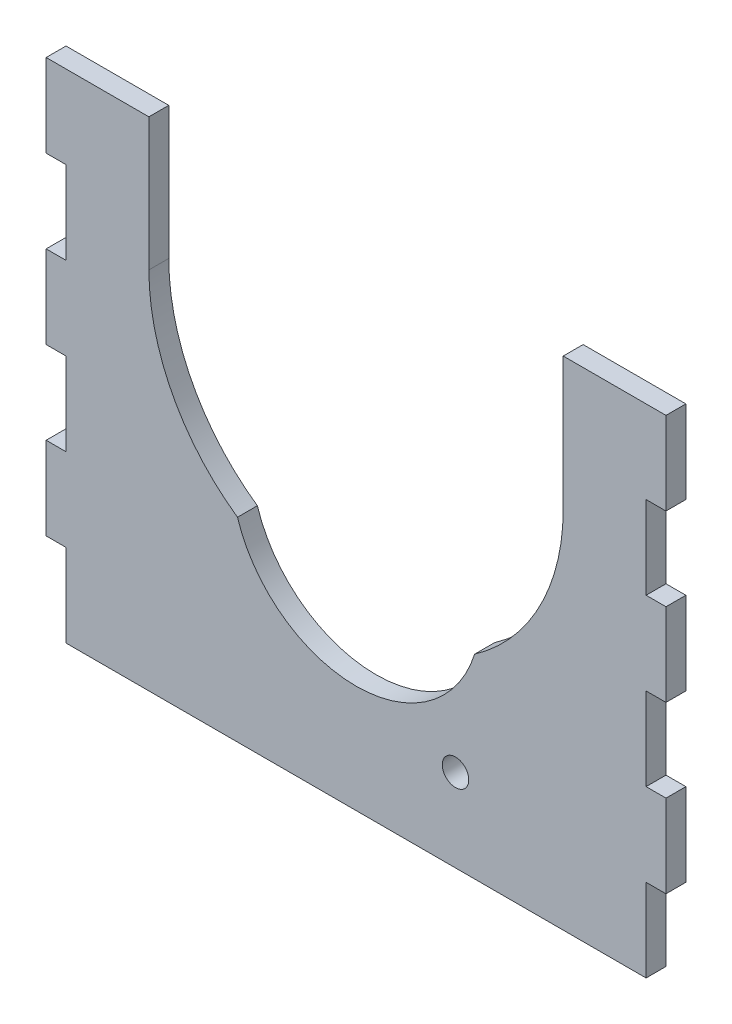
ISO-10303-21;
HEADER;
FILE_DESCRIPTION(('STEP AP214'),'2;1');
FILE_NAME('part.step','',(''),(''),'','','');
FILE_SCHEMA(('AUTOMOTIVE_DESIGN { 1 0 10303 214 1 1 1 1 }'));
ENDSEC;
DATA;
#1=APPLICATION_CONTEXT('core data for automotive mechanical design processes');
#2=APPLICATION_PROTOCOL_DEFINITION('international standard','automotive_design',2000,#1);
#3=PRODUCT_CONTEXT('',#1,'mechanical');
#4=PRODUCT('Part','Part','',(#3));
#5=PRODUCT_RELATED_PRODUCT_CATEGORY('part','',(#4));
#6=PRODUCT_DEFINITION_FORMATION('','',#4);
#7=PRODUCT_DEFINITION_CONTEXT('part definition',#1,'design');
#8=PRODUCT_DEFINITION('design','',#6,#7);
#9=PRODUCT_DEFINITION_SHAPE('','',#8);
#10=(LENGTH_UNIT() NAMED_UNIT(*) SI_UNIT(.MILLI.,.METRE.));
#11=(NAMED_UNIT(*) PLANE_ANGLE_UNIT() SI_UNIT($,.RADIAN.));
#12=(NAMED_UNIT(*) SI_UNIT($,.STERADIAN.) SOLID_ANGLE_UNIT());
#13=UNCERTAINTY_MEASURE_WITH_UNIT(LENGTH_MEASURE(1.E-05),#10,'distance_accuracy_value','');
#14=(GEOMETRIC_REPRESENTATION_CONTEXT(3) GLOBAL_UNCERTAINTY_ASSIGNED_CONTEXT((#13)) GLOBAL_UNIT_ASSIGNED_CONTEXT((#10,
#11,#12)) REPRESENTATION_CONTEXT('',''));
#15=CARTESIAN_POINT('',(0.,0.,0.));
#16=DIRECTION('',(0.,0.,1.));
#17=DIRECTION('',(1.,0.,0.));
#18=AXIS2_PLACEMENT_3D('',#15,#16,#17);
#19=CARTESIAN_POINT('',(0.,0.,6.));
#20=DIRECTION('',(-1.,0.,0.));
#21=DIRECTION('',(0.,0.,1.));
#22=AXIS2_PLACEMENT_3D('',#19,#20,#21);
#23=PLANE('',#22);
#24=DIRECTION('',(0.,1.,0.));
#25=VECTOR('',#24,1.);
#26=CARTESIAN_POINT('',(0.,0.,0.));
#27=LINE('',#26,#25);
#28=CARTESIAN_POINT('',(0.,0.,0.));
#29=VERTEX_POINT('',#28);
#30=CARTESIAN_POINT('',(0.,25.0000000000003,0.));
#31=VERTEX_POINT('',#30);
#32=EDGE_CURVE('E496',#29,#31,#27,.T.);
#33=ORIENTED_EDGE('',*,*,#32,.T.);
#34=DIRECTION('',(0.,0.,1.));
#35=VECTOR('',#34,1.);
#36=CARTESIAN_POINT('',(0.,25.0000000000003,0.));
#37=LINE('',#36,#35);
#38=CARTESIAN_POINT('',(0.,25.0000000000003,6.));
#39=VERTEX_POINT('',#38);
#40=EDGE_CURVE('E68',#31,#39,#37,.T.);
#41=ORIENTED_EDGE('',*,*,#40,.T.);
#42=DIRECTION('',(0.,1.,0.));
#43=VECTOR('',#42,1.);
#44=CARTESIAN_POINT('',(0.,0.,6.));
#45=LINE('',#44,#43);
#46=CARTESIAN_POINT('',(0.,0.,6.));
#47=VERTEX_POINT('',#46);
#48=EDGE_CURVE('E461',#47,#39,#45,.T.);
#49=ORIENTED_EDGE('',*,*,#48,.F.);
#50=DIRECTION('',(0.,0.,-1.));
#51=VECTOR('',#50,1.);
#52=CARTESIAN_POINT('',(0.,0.,6.));
#53=LINE('',#52,#51);
#54=EDGE_CURVE('E495',#47,#29,#53,.T.);
#55=ORIENTED_EDGE('',*,*,#54,.T.);
#56=EDGE_LOOP('',(#33,#41,#49,#55));
#57=FACE_BOUND('',#56,.T.);
#58=ADVANCED_FACE('F44',(#57),#23,.F.);
#59=CARTESIAN_POINT('',(-175.,0.,6.));
#60=DIRECTION('',(1.,0.,0.));
#61=DIRECTION('',(0.,1.,0.));
#62=AXIS2_PLACEMENT_3D('',#59,#60,#61);
#63=PLANE('',#62);
#64=DIRECTION('',(0.,-1.,0.));
#65=VECTOR('',#64,1.);
#66=CARTESIAN_POINT('',(-175.,0.,6.));
#67=LINE('',#66,#65);
#68=CARTESIAN_POINT('',(-175.,25.,6.));
#69=VERTEX_POINT('',#68);
#70=CARTESIAN_POINT('',(-175.,0.,6.));
#71=VERTEX_POINT('',#70);
#72=EDGE_CURVE('E486',#69,#71,#67,.T.);
#73=ORIENTED_EDGE('',*,*,#72,.F.);
#74=DIRECTION('',(0.,0.,1.));
#75=VECTOR('',#74,1.);
#76=CARTESIAN_POINT('',(-175.,25.,0.));
#77=LINE('',#76,#75);
#78=CARTESIAN_POINT('',(-175.,25.,0.));
#79=VERTEX_POINT('',#78);
#80=EDGE_CURVE('E320',#79,#69,#77,.T.);
#81=ORIENTED_EDGE('',*,*,#80,.F.);
#82=DIRECTION('',(0.,-1.,0.));
#83=VECTOR('',#82,1.);
#84=CARTESIAN_POINT('',(-175.,0.,0.));
#85=LINE('',#84,#83);
#86=CARTESIAN_POINT('',(-175.,0.,0.));
#87=VERTEX_POINT('',#86);
#88=EDGE_CURVE('E520',#79,#87,#85,.T.);
#89=ORIENTED_EDGE('',*,*,#88,.T.);
#90=DIRECTION('',(0.,0.,-1.));
#91=VECTOR('',#90,1.);
#92=CARTESIAN_POINT('',(-175.,0.,6.));
#93=LINE('',#92,#91);
#94=EDGE_CURVE('E531',#71,#87,#93,.T.);
#95=ORIENTED_EDGE('',*,*,#94,.F.);
#96=EDGE_LOOP('',(#73,#81,#89,#95));
#97=FACE_BOUND('',#96,.T.);
#98=ADVANCED_FACE('F621',(#97),#63,.F.);
#99=CARTESIAN_POINT('',(0.,50.0000000000003,6.));
#100=VERTEX_POINT('',#99);
#101=CARTESIAN_POINT('',(0.,75.0000000000003,6.));
#102=VERTEX_POINT('',#101);
#103=EDGE_CURVE('E60',#100,#102,#45,.T.);
#104=ORIENTED_EDGE('',*,*,#103,.F.);
#105=DIRECTION('',(0.,0.,1.));
#106=VECTOR('',#105,1.);
#107=CARTESIAN_POINT('',(0.,50.0000000000003,0.));
#108=LINE('',#107,#106);
#109=CARTESIAN_POINT('',(0.,50.0000000000003,0.));
#110=VERTEX_POINT('',#109);
#111=EDGE_CURVE('E255',#110,#100,#108,.T.);
#112=ORIENTED_EDGE('',*,*,#111,.F.);
#113=CARTESIAN_POINT('',(0.,75.0000000000003,0.));
#114=VERTEX_POINT('',#113);
#115=EDGE_CURVE('E266',#110,#114,#27,.T.);
#116=ORIENTED_EDGE('',*,*,#115,.T.);
#117=DIRECTION('',(0.,0.,1.));
#118=VECTOR('',#117,1.);
#119=CARTESIAN_POINT('',(0.,75.0000000000003,0.));
#120=LINE('',#119,#118);
#121=EDGE_CURVE('E361',#114,#102,#120,.T.);
#122=ORIENTED_EDGE('',*,*,#121,.T.);
#123=EDGE_LOOP('',(#104,#112,#116,#122));
#124=FACE_BOUND('',#123,.T.);
#125=ADVANCED_FACE('F595',(#124),#23,.F.);
#126=CARTESIAN_POINT('',(-175.,75.,0.));
#127=VERTEX_POINT('',#126);
#128=CARTESIAN_POINT('',(-175.,50.,0.));
#129=VERTEX_POINT('',#128);
#130=EDGE_CURVE('E525',#127,#129,#85,.T.);
#131=ORIENTED_EDGE('',*,*,#130,.T.);
#132=DIRECTION('',(0.,0.,1.));
#133=VECTOR('',#132,1.);
#134=CARTESIAN_POINT('',(-175.,50.,0.));
#135=LINE('',#134,#133);
#136=CARTESIAN_POINT('',(-175.,50.,6.));
#137=VERTEX_POINT('',#136);
#138=EDGE_CURVE('E309',#129,#137,#135,.T.);
#139=ORIENTED_EDGE('',*,*,#138,.T.);
#140=CARTESIAN_POINT('',(-175.,75.,6.));
#141=VERTEX_POINT('',#140);
#142=EDGE_CURVE('E492',#141,#137,#67,.T.);
#143=ORIENTED_EDGE('',*,*,#142,.F.);
#144=DIRECTION('',(0.,0.,1.));
#145=VECTOR('',#144,1.);
#146=CARTESIAN_POINT('',(-175.,75.,0.));
#147=LINE('',#146,#145);
#148=EDGE_CURVE('E394',#127,#141,#147,.T.);
#149=ORIENTED_EDGE('',*,*,#148,.F.);
#150=EDGE_LOOP('',(#131,#139,#143,#149));
#151=FACE_BOUND('',#150,.T.);
#152=ADVANCED_FACE('F627',(#151),#63,.F.);
#153=CARTESIAN_POINT('',(-175.,125.,0.));
#154=VERTEX_POINT('',#153);
#155=CARTESIAN_POINT('',(-175.,100.,0.));
#156=VERTEX_POINT('',#155);
#157=EDGE_CURVE('E521',#154,#156,#85,.T.);
#158=ORIENTED_EDGE('',*,*,#157,.T.);
#159=DIRECTION('',(0.,0.,1.));
#160=VECTOR('',#159,1.);
#161=CARTESIAN_POINT('',(-175.,100.,0.));
#162=LINE('',#161,#160);
#163=CARTESIAN_POINT('',(-175.,100.,6.));
#164=VERTEX_POINT('',#163);
#165=EDGE_CURVE('E383',#156,#164,#162,.T.);
#166=ORIENTED_EDGE('',*,*,#165,.T.);
#167=CARTESIAN_POINT('',(-175.,125.,6.));
#168=VERTEX_POINT('',#167);
#169=EDGE_CURVE('E487',#168,#164,#67,.T.);
#170=ORIENTED_EDGE('',*,*,#169,.F.);
#171=DIRECTION('',(0.,0.,1.));
#172=VECTOR('',#171,1.);
#173=CARTESIAN_POINT('',(-175.,125.,0.));
#174=LINE('',#173,#172);
#175=EDGE_CURVE('E450',#154,#168,#174,.T.);
#176=ORIENTED_EDGE('',*,*,#175,.F.);
#177=EDGE_LOOP('',(#158,#166,#170,#176));
#178=FACE_BOUND('',#177,.T.);
#179=ADVANCED_FACE('F628',(#178),#63,.F.);
#180=CARTESIAN_POINT('',(0.,100.,6.));
#181=VERTEX_POINT('',#180);
#182=CARTESIAN_POINT('',(0.,125.,6.));
#183=VERTEX_POINT('',#182);
#184=EDGE_CURVE('E465',#181,#183,#45,.T.);
#185=ORIENTED_EDGE('',*,*,#184,.F.);
#186=DIRECTION('',(0.,0.,1.));
#187=VECTOR('',#186,1.);
#188=CARTESIAN_POINT('',(0.,100.,0.));
#189=LINE('',#188,#187);
#190=CARTESIAN_POINT('',(0.,100.,0.));
#191=VERTEX_POINT('',#190);
#192=EDGE_CURVE('E364',#191,#181,#189,.T.);
#193=ORIENTED_EDGE('',*,*,#192,.F.);
#194=CARTESIAN_POINT('',(0.,125.,0.));
#195=VERTEX_POINT('',#194);
#196=EDGE_CURVE('E454',#191,#195,#27,.T.);
#197=ORIENTED_EDGE('',*,*,#196,.T.);
#198=DIRECTION('',(0.,0.,1.));
#199=VECTOR('',#198,1.);
#200=CARTESIAN_POINT('',(0.,125.,0.));
#201=LINE('',#200,#199);
#202=EDGE_CURVE('E427',#195,#183,#201,.T.);
#203=ORIENTED_EDGE('',*,*,#202,.T.);
#204=EDGE_LOOP('',(#185,#193,#197,#203));
#205=FACE_BOUND('',#204,.T.);
#206=ADVANCED_FACE('F46',(#205),#23,.F.);
#207=CARTESIAN_POINT('',(0.,150.,6.));
#208=DIRECTION('',(0.,-1.,0.));
#209=DIRECTION('',(1.,0.,0.));
#210=AXIS2_PLACEMENT_3D('',#207,#208,#209);
#211=PLANE('',#210);
#212=DIRECTION('',(-1.,0.,0.));
#213=VECTOR('',#212,1.);
#214=CARTESIAN_POINT('',(0.,150.,0.));
#215=LINE('',#214,#213);
#216=CARTESIAN_POINT('',(5.99999999999998,150.,0.));
#217=VERTEX_POINT('',#216);
#218=CARTESIAN_POINT('',(-25.,150.,0.));
#219=VERTEX_POINT('',#218);
#220=EDGE_CURVE('E499',#217,#219,#215,.T.);
#221=ORIENTED_EDGE('',*,*,#220,.T.);
#222=DIRECTION('',(0.,0.,-1.));
#223=VECTOR('',#222,1.);
#224=CARTESIAN_POINT('',(-25.,150.,6.));
#225=LINE('',#224,#223);
#226=CARTESIAN_POINT('',(-25.,150.,6.));
#227=VERTEX_POINT('',#226);
#228=EDGE_CURVE('E11',#227,#219,#225,.T.);
#229=ORIENTED_EDGE('',*,*,#228,.F.);
#230=DIRECTION('',(-1.,0.,0.));
#231=VECTOR('',#230,1.);
#232=CARTESIAN_POINT('',(0.,150.,6.));
#233=LINE('',#232,#231);
#234=CARTESIAN_POINT('',(5.99999999999998,150.,6.));
#235=VERTEX_POINT('',#234);
#236=EDGE_CURVE('E464',#235,#227,#233,.T.);
#237=ORIENTED_EDGE('',*,*,#236,.F.);
#238=DIRECTION('',(0.,0.,1.));
#239=VECTOR('',#238,1.);
#240=CARTESIAN_POINT('',(5.99999999999998,150.,0.));
#241=LINE('',#240,#239);
#242=EDGE_CURVE('E416',#217,#235,#241,.T.);
#243=ORIENTED_EDGE('',*,*,#242,.F.);
#244=EDGE_LOOP('',(#221,#229,#237,#243));
#245=FACE_BOUND('',#244,.T.);
#246=ADVANCED_FACE('F579',(#245),#211,.F.);
#247=CARTESIAN_POINT('',(-25.,110.,6.));
#248=DIRECTION('',(1.,0.,0.));
#249=DIRECTION('',(0.,1.,0.));
#250=AXIS2_PLACEMENT_3D('',#247,#248,#249);
#251=PLANE('',#250);
#252=DIRECTION('',(0.,-1.,0.));
#253=VECTOR('',#252,1.);
#254=CARTESIAN_POINT('',(-25.,110.,0.));
#255=LINE('',#254,#253);
#256=CARTESIAN_POINT('',(-25.,110.,0.));
#257=VERTEX_POINT('',#256);
#258=EDGE_CURVE('E502',#219,#257,#255,.T.);
#259=ORIENTED_EDGE('',*,*,#258,.T.);
#260=DIRECTION('',(0.,0.,-1.));
#261=VECTOR('',#260,1.);
#262=CARTESIAN_POINT('',(-25.,110.,6.));
#263=LINE('',#262,#261);
#264=CARTESIAN_POINT('',(-25.,110.,6.));
#265=VERTEX_POINT('',#264);
#266=EDGE_CURVE('E53',#265,#257,#263,.T.);
#267=ORIENTED_EDGE('',*,*,#266,.F.);
#268=DIRECTION('',(0.,-1.,0.));
#269=VECTOR('',#268,1.);
#270=CARTESIAN_POINT('',(-25.,110.,6.));
#271=LINE('',#270,#269);
#272=EDGE_CURVE('E468',#227,#265,#271,.T.);
#273=ORIENTED_EDGE('',*,*,#272,.F.);
#274=ORIENTED_EDGE('',*,*,#228,.T.);
#275=EDGE_LOOP('',(#259,#267,#273,#274));
#276=FACE_BOUND('',#275,.T.);
#277=ADVANCED_FACE('F577',(#276),#251,.F.);
#278=CARTESIAN_POINT('',(-87.5,110.,6.));
#279=DIRECTION('',(0.,0.,-1.));
#280=DIRECTION('',(-1.,0.,0.));
#281=AXIS2_PLACEMENT_3D('',#278,#279,#280);
#282=CYLINDRICAL_SURFACE('',#281,62.5);
#283=CARTESIAN_POINT('',(-87.5,110.,0.));
#284=DIRECTION('',(0.,0.,-1.));
#285=DIRECTION('',(1.,0.,0.));
#286=AXIS2_PLACEMENT_3D('',#283,#284,#285);
#287=CIRCLE('',#286,62.5);
#288=CARTESIAN_POINT('',(-51.7272799468645,58.75,0.));
#289=VERTEX_POINT('',#288);
#290=EDGE_CURVE('E505',#257,#289,#287,.T.);
#291=ORIENTED_EDGE('',*,*,#290,.T.);
#292=DIRECTION('',(0.,0.,-1.));
#293=VECTOR('',#292,1.);
#294=CARTESIAN_POINT('',(-51.7272799468645,58.75,6.));
#295=LINE('',#294,#293);
#296=CARTESIAN_POINT('',(-51.7272799468645,58.75,6.));
#297=VERTEX_POINT('',#296);
#298=EDGE_CURVE('E547',#297,#289,#295,.T.);
#299=ORIENTED_EDGE('',*,*,#298,.F.);
#300=CARTESIAN_POINT('',(-87.5,110.,6.));
#301=DIRECTION('',(0.,0.,-1.));
#302=DIRECTION('',(1.,0.,0.));
#303=AXIS2_PLACEMENT_3D('',#300,#301,#302);
#304=CIRCLE('',#303,62.5);
#305=EDGE_CURVE('E471',#265,#297,#304,.T.);
#306=ORIENTED_EDGE('',*,*,#305,.F.);
#307=ORIENTED_EDGE('',*,*,#266,.T.);
#308=EDGE_LOOP('',(#291,#299,#306,#307));
#309=FACE_BOUND('',#308,.T.);
#310=ADVANCED_FACE('F556',(#309),#282,.F.);
#311=CARTESIAN_POINT('',(-87.5,70.,6.));
#312=DIRECTION('',(0.,0.,-1.));
#313=DIRECTION('',(-1.,0.,0.));
#314=AXIS2_PLACEMENT_3D('',#311,#312,#313);
#315=CYLINDRICAL_SURFACE('',#314,37.5);
#316=CARTESIAN_POINT('',(-87.5,70.,0.));
#317=DIRECTION('',(0.,0.,-1.));
#318=DIRECTION('',(1.,0.,0.));
#319=AXIS2_PLACEMENT_3D('',#316,#317,#318);
#320=CIRCLE('',#319,37.5);
#321=CARTESIAN_POINT('',(-123.272720053135,58.75,0.));
#322=VERTEX_POINT('',#321);
#323=EDGE_CURVE('E508',#289,#322,#320,.T.);
#324=ORIENTED_EDGE('',*,*,#323,.T.);
#325=DIRECTION('',(0.,0.,-1.));
#326=VECTOR('',#325,1.);
#327=CARTESIAN_POINT('',(-123.272720053135,58.75,6.));
#328=LINE('',#327,#326);
#329=CARTESIAN_POINT('',(-123.272720053135,58.75,6.));
#330=VERTEX_POINT('',#329);
#331=EDGE_CURVE('E543',#330,#322,#328,.T.);
#332=ORIENTED_EDGE('',*,*,#331,.F.);
#333=CARTESIAN_POINT('',(-87.5,70.,6.));
#334=DIRECTION('',(0.,0.,-1.));
#335=DIRECTION('',(1.,0.,0.));
#336=AXIS2_PLACEMENT_3D('',#333,#334,#335);
#337=CIRCLE('',#336,37.5);
#338=EDGE_CURVE('E474',#297,#330,#337,.T.);
#339=ORIENTED_EDGE('',*,*,#338,.F.);
#340=ORIENTED_EDGE('',*,*,#298,.T.);
#341=EDGE_LOOP('',(#324,#332,#339,#340));
#342=FACE_BOUND('',#341,.T.);
#343=ADVANCED_FACE('F566',(#342),#315,.F.);
#344=CARTESIAN_POINT('',(-87.5,110.,6.));
#345=DIRECTION('',(0.,0.,-1.));
#346=DIRECTION('',(-1.,0.,0.));
#347=AXIS2_PLACEMENT_3D('',#344,#345,#346);
#348=CYLINDRICAL_SURFACE('',#347,62.5);
#349=CARTESIAN_POINT('',(-87.5,110.,0.));
#350=DIRECTION('',(0.,0.,-1.));
#351=DIRECTION('',(1.,0.,0.));
#352=AXIS2_PLACEMENT_3D('',#349,#350,#351);
#353=CIRCLE('',#352,62.5);
#354=CARTESIAN_POINT('',(-150.,110.,0.));
#355=VERTEX_POINT('',#354);
#356=EDGE_CURVE('E511',#322,#355,#353,.T.);
#357=ORIENTED_EDGE('',*,*,#356,.T.);
#358=DIRECTION('',(0.,0.,-1.));
#359=VECTOR('',#358,1.);
#360=CARTESIAN_POINT('',(-150.,110.,6.));
#361=LINE('',#360,#359);
#362=CARTESIAN_POINT('',(-150.,110.,6.));
#363=VERTEX_POINT('',#362);
#364=EDGE_CURVE('E539',#363,#355,#361,.T.);
#365=ORIENTED_EDGE('',*,*,#364,.F.);
#366=CARTESIAN_POINT('',(-87.5,110.,6.));
#367=DIRECTION('',(0.,0.,-1.));
#368=DIRECTION('',(1.,0.,0.));
#369=AXIS2_PLACEMENT_3D('',#366,#367,#368);
#370=CIRCLE('',#369,62.5);
#371=EDGE_CURVE('E477',#330,#363,#370,.T.);
#372=ORIENTED_EDGE('',*,*,#371,.F.);
#373=ORIENTED_EDGE('',*,*,#331,.T.);
#374=EDGE_LOOP('',(#357,#365,#372,#373));
#375=FACE_BOUND('',#374,.T.);
#376=ADVANCED_FACE('F570',(#375),#348,.F.);
#377=CARTESIAN_POINT('',(-150.,110.,6.));
#378=DIRECTION('',(-1.,0.,0.));
#379=DIRECTION('',(0.,-1.,0.));
#380=AXIS2_PLACEMENT_3D('',#377,#378,#379);
#381=PLANE('',#380);
#382=DIRECTION('',(0.,1.,0.));
#383=VECTOR('',#382,1.);
#384=CARTESIAN_POINT('',(-150.,110.,0.));
#385=LINE('',#384,#383);
#386=CARTESIAN_POINT('',(-150.,150.,0.));
#387=VERTEX_POINT('',#386);
#388=EDGE_CURVE('E514',#355,#387,#385,.T.);
#389=ORIENTED_EDGE('',*,*,#388,.T.);
#390=DIRECTION('',(0.,0.,-1.));
#391=VECTOR('',#390,1.);
#392=CARTESIAN_POINT('',(-150.,150.,6.));
#393=LINE('',#392,#391);
#394=CARTESIAN_POINT('',(-150.,150.,6.));
#395=VERTEX_POINT('',#394);
#396=EDGE_CURVE('E535',#395,#387,#393,.T.);
#397=ORIENTED_EDGE('',*,*,#396,.F.);
#398=DIRECTION('',(0.,1.,0.));
#399=VECTOR('',#398,1.);
#400=CARTESIAN_POINT('',(-150.,110.,6.));
#401=LINE('',#400,#399);
#402=EDGE_CURVE('E480',#363,#395,#401,.T.);
#403=ORIENTED_EDGE('',*,*,#402,.F.);
#404=ORIENTED_EDGE('',*,*,#364,.T.);
#405=EDGE_LOOP('',(#389,#397,#403,#404));
#406=FACE_BOUND('',#405,.T.);
#407=ADVANCED_FACE('F647',(#406),#381,.F.);
#408=CARTESIAN_POINT('',(-150.,150.,6.));
#409=DIRECTION('',(0.,-1.,0.));
#410=DIRECTION('',(1.,0.,0.));
#411=AXIS2_PLACEMENT_3D('',#408,#409,#410);
#412=PLANE('',#411);
#413=DIRECTION('',(-1.,0.,0.));
#414=VECTOR('',#413,1.);
#415=CARTESIAN_POINT('',(-150.,150.,0.));
#416=LINE('',#415,#414);
#417=CARTESIAN_POINT('',(-181.,150.,0.));
#418=VERTEX_POINT('',#417);
#419=EDGE_CURVE('E517',#387,#418,#416,.T.);
#420=ORIENTED_EDGE('',*,*,#419,.T.);
#421=DIRECTION('',(0.,0.,1.));
#422=VECTOR('',#421,1.);
#423=CARTESIAN_POINT('',(-181.,150.,0.));
#424=LINE('',#423,#422);
#425=CARTESIAN_POINT('',(-181.,150.,6.));
#426=VERTEX_POINT('',#425);
#427=EDGE_CURVE('E443',#418,#426,#424,.T.);
#428=ORIENTED_EDGE('',*,*,#427,.T.);
#429=DIRECTION('',(-1.,0.,0.));
#430=VECTOR('',#429,1.);
#431=CARTESIAN_POINT('',(-150.,150.,6.));
#432=LINE('',#431,#430);
#433=EDGE_CURVE('E483',#395,#426,#432,.T.);
#434=ORIENTED_EDGE('',*,*,#433,.F.);
#435=ORIENTED_EDGE('',*,*,#396,.T.);
#436=EDGE_LOOP('',(#420,#428,#434,#435));
#437=FACE_BOUND('',#436,.T.);
#438=ADVANCED_FACE('F644',(#437),#412,.F.);
#439=CARTESIAN_POINT('',(0.,0.,6.));
#440=DIRECTION('',(0.,1.,0.));
#441=DIRECTION('',(-1.,0.,0.));
#442=AXIS2_PLACEMENT_3D('',#439,#440,#441);
#443=PLANE('',#442);
#444=DIRECTION('',(1.,0.,0.));
#445=VECTOR('',#444,1.);
#446=CARTESIAN_POINT('',(0.,0.,0.));
#447=LINE('',#446,#445);
#448=EDGE_CURVE('E524',#87,#29,#447,.T.);
#449=ORIENTED_EDGE('',*,*,#448,.T.);
#450=ORIENTED_EDGE('',*,*,#54,.F.);
#451=DIRECTION('',(1.,0.,0.));
#452=VECTOR('',#451,1.);
#453=CARTESIAN_POINT('',(0.,0.,6.));
#454=LINE('',#453,#452);
#455=EDGE_CURVE('E491',#71,#47,#454,.T.);
#456=ORIENTED_EDGE('',*,*,#455,.F.);
#457=ORIENTED_EDGE('',*,*,#94,.T.);
#458=EDGE_LOOP('',(#449,#450,#456,#457));
#459=FACE_BOUND('',#458,.T.);
#460=ADVANCED_FACE('F642',(#459),#443,.F.);
#461=CARTESIAN_POINT('',(-87.5,110.,6.));
#462=DIRECTION('',(0.,0.,1.));
#463=DIRECTION('',(1.,0.,0.));
#464=AXIS2_PLACEMENT_3D('',#461,#462,#463);
#465=PLANE('',#464);
#466=CARTESIAN_POINT('',(-57.5,25.,6.));
#467=DIRECTION('',(0.,0.,1.));
#468=DIRECTION('',(1.,0.,0.));
#469=AXIS2_PLACEMENT_3D('',#466,#467,#468);
#470=CIRCLE('',#469,4.00000000000001);
#471=CARTESIAN_POINT('',(-53.5,25.,6.));
#472=VERTEX_POINT('',#471);
#473=EDGE_CURVE('E278',#472,#472,#470,.T.);
#474=ORIENTED_EDGE('',*,*,#473,.F.);
#475=EDGE_LOOP('',(#474));
#476=FACE_BOUND('',#475,.T.);
#477=ORIENTED_EDGE('',*,*,#48,.T.);
#478=DIRECTION('',(1.,0.,0.));
#479=VECTOR('',#478,1.);
#480=CARTESIAN_POINT('',(6.00000000000001,25.0000000000003,6.));
#481=LINE('',#480,#479);
#482=CARTESIAN_POINT('',(6.00000000000001,25.0000000000003,6.));
#483=VERTEX_POINT('',#482);
#484=EDGE_CURVE('E272',#39,#483,#481,.T.);
#485=ORIENTED_EDGE('',*,*,#484,.T.);
#486=DIRECTION('',(0.,1.,0.));
#487=VECTOR('',#486,1.);
#488=CARTESIAN_POINT('',(6.00000000000001,50.0000000000003,6.));
#489=LINE('',#488,#487);
#490=CARTESIAN_POINT('',(6.00000000000001,50.0000000000003,6.));
#491=VERTEX_POINT('',#490);
#492=EDGE_CURVE('E283',#483,#491,#489,.T.);
#493=ORIENTED_EDGE('',*,*,#492,.T.);
#494=DIRECTION('',(-1.,0.,0.));
#495=VECTOR('',#494,1.);
#496=CARTESIAN_POINT('',(6.00000000000001,50.0000000000003,6.));
#497=LINE('',#496,#495);
#498=EDGE_CURVE('E249',#491,#100,#497,.T.);
#499=ORIENTED_EDGE('',*,*,#498,.T.);
#500=ORIENTED_EDGE('',*,*,#103,.T.);
#501=DIRECTION('',(1.,0.,0.));
#502=VECTOR('',#501,1.);
#503=CARTESIAN_POINT('',(5.99999999999998,75.0000000000003,6.));
#504=LINE('',#503,#502);
#505=CARTESIAN_POINT('',(5.99999999999998,75.0000000000003,6.));
#506=VERTEX_POINT('',#505);
#507=EDGE_CURVE('E338',#102,#506,#504,.T.);
#508=ORIENTED_EDGE('',*,*,#507,.T.);
#509=DIRECTION('',(0.,1.,0.));
#510=VECTOR('',#509,1.);
#511=CARTESIAN_POINT('',(5.99999999999998,100.,6.));
#512=LINE('',#511,#510);
#513=CARTESIAN_POINT('',(5.99999999999998,100.,6.));
#514=VERTEX_POINT('',#513);
#515=EDGE_CURVE('E324',#506,#514,#512,.T.);
#516=ORIENTED_EDGE('',*,*,#515,.T.);
#517=DIRECTION('',(-1.,0.,0.));
#518=VECTOR('',#517,1.);
#519=CARTESIAN_POINT('',(5.99999999999998,100.,6.));
#520=LINE('',#519,#518);
#521=EDGE_CURVE('E350',#514,#181,#520,.T.);
#522=ORIENTED_EDGE('',*,*,#521,.T.);
#523=ORIENTED_EDGE('',*,*,#184,.T.);
#524=DIRECTION('',(1.,0.,0.));
#525=VECTOR('',#524,1.);
#526=CARTESIAN_POINT('',(5.99999999999998,125.,6.));
#527=LINE('',#526,#525);
#528=CARTESIAN_POINT('',(5.99999999999998,125.,6.));
#529=VERTEX_POINT('',#528);
#530=EDGE_CURVE('E412',#183,#529,#527,.T.);
#531=ORIENTED_EDGE('',*,*,#530,.T.);
#532=DIRECTION('',(0.,1.,0.));
#533=VECTOR('',#532,1.);
#534=CARTESIAN_POINT('',(5.99999999999998,150.,6.));
#535=LINE('',#534,#533);
#536=EDGE_CURVE('E398',#529,#235,#535,.T.);
#537=ORIENTED_EDGE('',*,*,#536,.T.);
#538=ORIENTED_EDGE('',*,*,#236,.T.);
#539=ORIENTED_EDGE('',*,*,#272,.T.);
#540=ORIENTED_EDGE('',*,*,#305,.T.);
#541=ORIENTED_EDGE('',*,*,#338,.T.);
#542=ORIENTED_EDGE('',*,*,#371,.T.);
#543=ORIENTED_EDGE('',*,*,#402,.T.);
#544=ORIENTED_EDGE('',*,*,#433,.T.);
#545=DIRECTION('',(0.,-1.,0.));
#546=VECTOR('',#545,1.);
#547=CARTESIAN_POINT('',(-181.,150.,6.));
#548=LINE('',#547,#546);
#549=CARTESIAN_POINT('',(-181.,125.,6.));
#550=VERTEX_POINT('',#549);
#551=EDGE_CURVE('E426',#426,#550,#548,.T.);
#552=ORIENTED_EDGE('',*,*,#551,.T.);
#553=DIRECTION('',(1.,0.,0.));
#554=VECTOR('',#553,1.);
#555=CARTESIAN_POINT('',(-175.,125.,6.));
#556=LINE('',#555,#554);
#557=EDGE_CURVE('E439',#550,#168,#556,.T.);
#558=ORIENTED_EDGE('',*,*,#557,.T.);
#559=ORIENTED_EDGE('',*,*,#169,.T.);
#560=DIRECTION('',(-1.,0.,0.));
#561=VECTOR('',#560,1.);
#562=CARTESIAN_POINT('',(-175.,100.,6.));
#563=LINE('',#562,#561);
#564=CARTESIAN_POINT('',(-181.,100.,6.));
#565=VERTEX_POINT('',#564);
#566=EDGE_CURVE('E360',#164,#565,#563,.T.);
#567=ORIENTED_EDGE('',*,*,#566,.T.);
#568=DIRECTION('',(0.,-1.,0.));
#569=VECTOR('',#568,1.);
#570=CARTESIAN_POINT('',(-181.,100.,6.));
#571=LINE('',#570,#569);
#572=CARTESIAN_POINT('',(-181.,75.,6.));
#573=VERTEX_POINT('',#572);
#574=EDGE_CURVE('E387',#565,#573,#571,.T.);
#575=ORIENTED_EDGE('',*,*,#574,.T.);
#576=DIRECTION('',(1.,0.,0.));
#577=VECTOR('',#576,1.);
#578=CARTESIAN_POINT('',(-175.,75.,6.));
#579=LINE('',#578,#577);
#580=EDGE_CURVE('E375',#573,#141,#579,.T.);
#581=ORIENTED_EDGE('',*,*,#580,.T.);
#582=ORIENTED_EDGE('',*,*,#142,.T.);
#583=DIRECTION('',(-1.,0.,0.));
#584=VECTOR('',#583,1.);
#585=CARTESIAN_POINT('',(-175.,50.,6.));
#586=LINE('',#585,#584);
#587=CARTESIAN_POINT('',(-181.,50.,6.));
#588=VERTEX_POINT('',#587);
#589=EDGE_CURVE('E291',#137,#588,#586,.T.);
#590=ORIENTED_EDGE('',*,*,#589,.T.);
#591=DIRECTION('',(0.,-1.,0.));
#592=VECTOR('',#591,1.);
#593=CARTESIAN_POINT('',(-181.,50.,6.));
#594=LINE('',#593,#592);
#595=CARTESIAN_POINT('',(-181.,25.,6.));
#596=VERTEX_POINT('',#595);
#597=EDGE_CURVE('E313',#588,#596,#594,.T.);
#598=ORIENTED_EDGE('',*,*,#597,.T.);
#599=DIRECTION('',(1.,0.,0.));
#600=VECTOR('',#599,1.);
#601=CARTESIAN_POINT('',(-175.,25.,6.));
#602=LINE('',#601,#600);
#603=EDGE_CURVE('E301',#596,#69,#602,.T.);
#604=ORIENTED_EDGE('',*,*,#603,.T.);
#605=ORIENTED_EDGE('',*,*,#72,.T.);
#606=ORIENTED_EDGE('',*,*,#455,.T.);
#607=EDGE_LOOP('',(#477,#485,#493,#499,#500,#508,#516,#522,#523,#531,#537,#538,#539,#540,#541,
#542,#543,#544,#552,#558,#559,#567,#575,#581,#582,#590,#598,#604,#605,#606));
#608=FACE_BOUND('',#607,.T.);
#609=ADVANCED_FACE('F574',(#476,#608),#465,.T.);
#610=CARTESIAN_POINT('',(-87.5,110.,0.));
#611=DIRECTION('',(0.,0.,1.));
#612=DIRECTION('',(1.,0.,0.));
#613=AXIS2_PLACEMENT_3D('',#610,#611,#612);
#614=PLANE('',#613);
#615=CARTESIAN_POINT('',(-57.5,25.,0.));
#616=DIRECTION('',(0.,0.,1.));
#617=DIRECTION('',(1.,0.,0.));
#618=AXIS2_PLACEMENT_3D('',#615,#616,#617);
#619=CIRCLE('',#618,4.00000000000001);
#620=CARTESIAN_POINT('',(-53.5,25.,0.));
#621=VERTEX_POINT('',#620);
#622=EDGE_CURVE('E286',#621,#621,#619,.T.);
#623=ORIENTED_EDGE('',*,*,#622,.T.);
#624=EDGE_LOOP('',(#623));
#625=FACE_BOUND('',#624,.T.);
#626=ORIENTED_EDGE('',*,*,#32,.F.);
#627=ORIENTED_EDGE('',*,*,#448,.F.);
#628=ORIENTED_EDGE('',*,*,#88,.F.);
#629=DIRECTION('',(1.,0.,0.));
#630=VECTOR('',#629,1.);
#631=CARTESIAN_POINT('',(-175.,25.,0.));
#632=LINE('',#631,#630);
#633=CARTESIAN_POINT('',(-181.,25.,0.));
#634=VERTEX_POINT('',#633);
#635=EDGE_CURVE('E305',#634,#79,#632,.T.);
#636=ORIENTED_EDGE('',*,*,#635,.F.);
#637=DIRECTION('',(0.,-1.,0.));
#638=VECTOR('',#637,1.);
#639=CARTESIAN_POINT('',(-181.,50.,0.));
#640=LINE('',#639,#638);
#641=CARTESIAN_POINT('',(-181.,50.,0.));
#642=VERTEX_POINT('',#641);
#643=EDGE_CURVE('E300',#642,#634,#640,.T.);
#644=ORIENTED_EDGE('',*,*,#643,.F.);
#645=DIRECTION('',(-1.,0.,0.));
#646=VECTOR('',#645,1.);
#647=CARTESIAN_POINT('',(-175.,50.,0.));
#648=LINE('',#647,#646);
#649=EDGE_CURVE('E296',#129,#642,#648,.T.);
#650=ORIENTED_EDGE('',*,*,#649,.F.);
#651=ORIENTED_EDGE('',*,*,#130,.F.);
#652=DIRECTION('',(1.,0.,0.));
#653=VECTOR('',#652,1.);
#654=CARTESIAN_POINT('',(-175.,75.,0.));
#655=LINE('',#654,#653);
#656=CARTESIAN_POINT('',(-181.,75.,0.));
#657=VERTEX_POINT('',#656);
#658=EDGE_CURVE('E379',#657,#127,#655,.T.);
#659=ORIENTED_EDGE('',*,*,#658,.F.);
#660=DIRECTION('',(0.,-1.,0.));
#661=VECTOR('',#660,1.);
#662=CARTESIAN_POINT('',(-181.,100.,0.));
#663=LINE('',#662,#661);
#664=CARTESIAN_POINT('',(-181.,100.,0.));
#665=VERTEX_POINT('',#664);
#666=EDGE_CURVE('E374',#665,#657,#663,.T.);
#667=ORIENTED_EDGE('',*,*,#666,.F.);
#668=DIRECTION('',(-1.,0.,0.));
#669=VECTOR('',#668,1.);
#670=CARTESIAN_POINT('',(-175.,100.,0.));
#671=LINE('',#670,#669);
#672=EDGE_CURVE('E370',#156,#665,#671,.T.);
#673=ORIENTED_EDGE('',*,*,#672,.F.);
#674=ORIENTED_EDGE('',*,*,#157,.F.);
#675=DIRECTION('',(1.,0.,0.));
#676=VECTOR('',#675,1.);
#677=CARTESIAN_POINT('',(-175.,125.,0.));
#678=LINE('',#677,#676);
#679=CARTESIAN_POINT('',(-181.,125.,0.));
#680=VERTEX_POINT('',#679);
#681=EDGE_CURVE('E438',#680,#154,#678,.T.);
#682=ORIENTED_EDGE('',*,*,#681,.F.);
#683=DIRECTION('',(0.,-1.,0.));
#684=VECTOR('',#683,1.);
#685=CARTESIAN_POINT('',(-181.,150.,0.));
#686=LINE('',#685,#684);
#687=EDGE_CURVE('E434',#418,#680,#686,.T.);
#688=ORIENTED_EDGE('',*,*,#687,.F.);
#689=ORIENTED_EDGE('',*,*,#419,.F.);
#690=ORIENTED_EDGE('',*,*,#388,.F.);
#691=ORIENTED_EDGE('',*,*,#356,.F.);
#692=ORIENTED_EDGE('',*,*,#323,.F.);
#693=ORIENTED_EDGE('',*,*,#290,.F.);
#694=ORIENTED_EDGE('',*,*,#258,.F.);
#695=ORIENTED_EDGE('',*,*,#220,.F.);
#696=DIRECTION('',(0.,1.,0.));
#697=VECTOR('',#696,1.);
#698=CARTESIAN_POINT('',(5.99999999999998,150.,0.));
#699=LINE('',#698,#697);
#700=CARTESIAN_POINT('',(5.99999999999998,125.,0.));
#701=VERTEX_POINT('',#700);
#702=EDGE_CURVE('E407',#701,#217,#699,.T.);
#703=ORIENTED_EDGE('',*,*,#702,.F.);
#704=DIRECTION('',(1.,0.,0.));
#705=VECTOR('',#704,1.);
#706=CARTESIAN_POINT('',(5.99999999999998,125.,0.));
#707=LINE('',#706,#705);
#708=EDGE_CURVE('E411',#195,#701,#707,.T.);
#709=ORIENTED_EDGE('',*,*,#708,.F.);
#710=ORIENTED_EDGE('',*,*,#196,.F.);
#711=DIRECTION('',(-1.,0.,0.));
#712=VECTOR('',#711,1.);
#713=CARTESIAN_POINT('',(5.99999999999998,100.,0.));
#714=LINE('',#713,#712);
#715=CARTESIAN_POINT('',(5.99999999999998,100.,0.));
#716=VERTEX_POINT('',#715);
#717=EDGE_CURVE('E337',#716,#191,#714,.T.);
#718=ORIENTED_EDGE('',*,*,#717,.F.);
#719=DIRECTION('',(0.,1.,0.));
#720=VECTOR('',#719,1.);
#721=CARTESIAN_POINT('',(5.99999999999998,100.,0.));
#722=LINE('',#721,#720);
#723=CARTESIAN_POINT('',(5.99999999999998,75.0000000000003,0.));
#724=VERTEX_POINT('',#723);
#725=EDGE_CURVE('E333',#724,#716,#722,.T.);
#726=ORIENTED_EDGE('',*,*,#725,.F.);
#727=DIRECTION('',(1.,0.,0.));
#728=VECTOR('',#727,1.);
#729=CARTESIAN_POINT('',(5.99999999999998,75.0000000000003,0.));
#730=LINE('',#729,#728);
#731=EDGE_CURVE('E342',#114,#724,#730,.T.);
#732=ORIENTED_EDGE('',*,*,#731,.F.);
#733=ORIENTED_EDGE('',*,*,#115,.F.);
#734=DIRECTION('',(-1.,0.,0.));
#735=VECTOR('',#734,1.);
#736=CARTESIAN_POINT('',(6.00000000000001,50.0000000000003,0.));
#737=LINE('',#736,#735);
#738=CARTESIAN_POINT('',(6.00000000000001,50.0000000000003,0.));
#739=VERTEX_POINT('',#738);
#740=EDGE_CURVE('E247',#739,#110,#737,.T.);
#741=ORIENTED_EDGE('',*,*,#740,.F.);
#742=DIRECTION('',(0.,1.,0.));
#743=VECTOR('',#742,1.);
#744=CARTESIAN_POINT('',(6.00000000000001,50.0000000000003,0.));
#745=LINE('',#744,#743);
#746=CARTESIAN_POINT('',(6.00000000000001,25.0000000000003,0.));
#747=VERTEX_POINT('',#746);
#748=EDGE_CURVE('E263',#747,#739,#745,.T.);
#749=ORIENTED_EDGE('',*,*,#748,.F.);
#750=DIRECTION('',(1.,0.,0.));
#751=VECTOR('',#750,1.);
#752=CARTESIAN_POINT('',(6.00000000000001,25.0000000000003,0.));
#753=LINE('',#752,#751);
#754=EDGE_CURVE('E256',#31,#747,#753,.T.);
#755=ORIENTED_EDGE('',*,*,#754,.F.);
#756=EDGE_LOOP('',(#626,#627,#628,#636,#644,#650,#651,#659,#667,#673,#674,#682,#688,#689,#690,
#691,#692,#693,#694,#695,#703,#709,#710,#718,#726,#732,#733,#741,#749,#755));
#757=FACE_BOUND('',#756,.T.);
#758=ADVANCED_FACE('F261',(#625,#757),#614,.F.);
#759=CARTESIAN_POINT('',(-175.,125.,0.));
#760=DIRECTION('',(0.,-1.,0.));
#761=DIRECTION('',(0.,0.,-1.));
#762=AXIS2_PLACEMENT_3D('',#759,#760,#761);
#763=PLANE('',#762);
#764=ORIENTED_EDGE('',*,*,#557,.F.);
#765=DIRECTION('',(0.,0.,1.));
#766=VECTOR('',#765,1.);
#767=CARTESIAN_POINT('',(-181.,125.,0.));
#768=LINE('',#767,#766);
#769=EDGE_CURVE('E455',#680,#550,#768,.T.);
#770=ORIENTED_EDGE('',*,*,#769,.F.);
#771=ORIENTED_EDGE('',*,*,#681,.T.);
#772=ORIENTED_EDGE('',*,*,#175,.T.);
#773=EDGE_LOOP('',(#764,#770,#771,#772));
#774=FACE_BOUND('',#773,.T.);
#775=ADVANCED_FACE('F709',(#774),#763,.T.);
#776=CARTESIAN_POINT('',(-181.,150.,0.));
#777=DIRECTION('',(-1.,0.,0.));
#778=DIRECTION('',(0.,0.,1.));
#779=AXIS2_PLACEMENT_3D('',#776,#777,#778);
#780=PLANE('',#779);
#781=ORIENTED_EDGE('',*,*,#551,.F.);
#782=ORIENTED_EDGE('',*,*,#427,.F.);
#783=ORIENTED_EDGE('',*,*,#687,.T.);
#784=ORIENTED_EDGE('',*,*,#769,.T.);
#785=EDGE_LOOP('',(#781,#782,#783,#784));
#786=FACE_BOUND('',#785,.T.);
#787=ADVANCED_FACE('F719',(#786),#780,.T.);
#788=CARTESIAN_POINT('',(5.99999999999998,150.,0.));
#789=DIRECTION('',(1.,0.,0.));
#790=DIRECTION('',(0.,0.,-1.));
#791=AXIS2_PLACEMENT_3D('',#788,#789,#790);
#792=PLANE('',#791);
#793=ORIENTED_EDGE('',*,*,#536,.F.);
#794=DIRECTION('',(0.,0.,1.));
#795=VECTOR('',#794,1.);
#796=CARTESIAN_POINT('',(5.99999999999998,125.,0.));
#797=LINE('',#796,#795);
#798=EDGE_CURVE('E423',#701,#529,#797,.T.);
#799=ORIENTED_EDGE('',*,*,#798,.F.);
#800=ORIENTED_EDGE('',*,*,#702,.T.);
#801=ORIENTED_EDGE('',*,*,#242,.T.);
#802=EDGE_LOOP('',(#793,#799,#800,#801));
#803=FACE_BOUND('',#802,.T.);
#804=ADVANCED_FACE('F727',(#803),#792,.T.);
#805=CARTESIAN_POINT('',(5.99999999999998,125.,0.));
#806=DIRECTION('',(0.,-1.,0.));
#807=DIRECTION('',(0.,0.,-1.));
#808=AXIS2_PLACEMENT_3D('',#805,#806,#807);
#809=PLANE('',#808);
#810=ORIENTED_EDGE('',*,*,#530,.F.);
#811=ORIENTED_EDGE('',*,*,#202,.F.);
#812=ORIENTED_EDGE('',*,*,#708,.T.);
#813=ORIENTED_EDGE('',*,*,#798,.T.);
#814=EDGE_LOOP('',(#810,#811,#812,#813));
#815=FACE_BOUND('',#814,.T.);
#816=ADVANCED_FACE('F587',(#815),#809,.T.);
#817=CARTESIAN_POINT('',(-175.,75.,0.));
#818=DIRECTION('',(0.,-1.,0.));
#819=DIRECTION('',(0.,0.,-1.));
#820=AXIS2_PLACEMENT_3D('',#817,#818,#819);
#821=PLANE('',#820);
#822=ORIENTED_EDGE('',*,*,#580,.F.);
#823=DIRECTION('',(0.,0.,1.));
#824=VECTOR('',#823,1.);
#825=CARTESIAN_POINT('',(-181.,75.,0.));
#826=LINE('',#825,#824);
#827=EDGE_CURVE('E399',#657,#573,#826,.T.);
#828=ORIENTED_EDGE('',*,*,#827,.F.);
#829=ORIENTED_EDGE('',*,*,#658,.T.);
#830=ORIENTED_EDGE('',*,*,#148,.T.);
#831=EDGE_LOOP('',(#822,#828,#829,#830));
#832=FACE_BOUND('',#831,.T.);
#833=ADVANCED_FACE('F740',(#832),#821,.T.);
#834=CARTESIAN_POINT('',(-181.,100.,0.));
#835=DIRECTION('',(-1.,0.,0.));
#836=DIRECTION('',(0.,0.,1.));
#837=AXIS2_PLACEMENT_3D('',#834,#835,#836);
#838=PLANE('',#837);
#839=ORIENTED_EDGE('',*,*,#574,.F.);
#840=DIRECTION('',(0.,0.,1.));
#841=VECTOR('',#840,1.);
#842=CARTESIAN_POINT('',(-181.,100.,0.));
#843=LINE('',#842,#841);
#844=EDGE_CURVE('E402',#665,#565,#843,.T.);
#845=ORIENTED_EDGE('',*,*,#844,.F.);
#846=ORIENTED_EDGE('',*,*,#666,.T.);
#847=ORIENTED_EDGE('',*,*,#827,.T.);
#848=EDGE_LOOP('',(#839,#845,#846,#847));
#849=FACE_BOUND('',#848,.T.);
#850=ADVANCED_FACE('F747',(#849),#838,.T.);
#851=CARTESIAN_POINT('',(-175.,100.,0.));
#852=DIRECTION('',(0.,1.,0.));
#853=DIRECTION('',(0.,0.,1.));
#854=AXIS2_PLACEMENT_3D('',#851,#852,#853);
#855=PLANE('',#854);
#856=ORIENTED_EDGE('',*,*,#566,.F.);
#857=ORIENTED_EDGE('',*,*,#165,.F.);
#858=ORIENTED_EDGE('',*,*,#672,.T.);
#859=ORIENTED_EDGE('',*,*,#844,.T.);
#860=EDGE_LOOP('',(#856,#857,#858,#859));
#861=FACE_BOUND('',#860,.T.);
#862=ADVANCED_FACE('F755',(#861),#855,.T.);
#863=CARTESIAN_POINT('',(5.99999999999998,100.,0.));
#864=DIRECTION('',(1.,0.,0.));
#865=DIRECTION('',(0.,0.,-1.));
#866=AXIS2_PLACEMENT_3D('',#863,#864,#865);
#867=PLANE('',#866);
#868=ORIENTED_EDGE('',*,*,#515,.F.);
#869=DIRECTION('',(0.,0.,1.));
#870=VECTOR('',#869,1.);
#871=CARTESIAN_POINT('',(5.99999999999998,75.0000000000003,0.));
#872=LINE('',#871,#870);
#873=EDGE_CURVE('E357',#724,#506,#872,.T.);
#874=ORIENTED_EDGE('',*,*,#873,.F.);
#875=ORIENTED_EDGE('',*,*,#725,.T.);
#876=DIRECTION('',(0.,0.,1.));
#877=VECTOR('',#876,1.);
#878=CARTESIAN_POINT('',(5.99999999999998,100.,0.));
#879=LINE('',#878,#877);
#880=EDGE_CURVE('E346',#716,#514,#879,.T.);
#881=ORIENTED_EDGE('',*,*,#880,.T.);
#882=EDGE_LOOP('',(#868,#874,#875,#881));
#883=FACE_BOUND('',#882,.T.);
#884=ADVANCED_FACE('F602',(#883),#867,.T.);
#885=CARTESIAN_POINT('',(5.99999999999998,75.0000000000003,0.));
#886=DIRECTION('',(0.,-1.,0.));
#887=DIRECTION('',(0.,0.,-1.));
#888=AXIS2_PLACEMENT_3D('',#885,#886,#887);
#889=PLANE('',#888);
#890=ORIENTED_EDGE('',*,*,#507,.F.);
#891=ORIENTED_EDGE('',*,*,#121,.F.);
#892=ORIENTED_EDGE('',*,*,#731,.T.);
#893=ORIENTED_EDGE('',*,*,#873,.T.);
#894=EDGE_LOOP('',(#890,#891,#892,#893));
#895=FACE_BOUND('',#894,.T.);
#896=ADVANCED_FACE('F598',(#895),#889,.T.);
#897=CARTESIAN_POINT('',(5.99999999999998,100.,0.));
#898=DIRECTION('',(0.,1.,0.));
#899=DIRECTION('',(0.,0.,1.));
#900=AXIS2_PLACEMENT_3D('',#897,#898,#899);
#901=PLANE('',#900);
#902=ORIENTED_EDGE('',*,*,#521,.F.);
#903=ORIENTED_EDGE('',*,*,#880,.F.);
#904=ORIENTED_EDGE('',*,*,#717,.T.);
#905=ORIENTED_EDGE('',*,*,#192,.T.);
#906=EDGE_LOOP('',(#902,#903,#904,#905));
#907=FACE_BOUND('',#906,.T.);
#908=ADVANCED_FACE('F607',(#907),#901,.T.);
#909=CARTESIAN_POINT('',(-175.,25.,0.));
#910=DIRECTION('',(0.,-1.,0.));
#911=DIRECTION('',(0.,0.,-1.));
#912=AXIS2_PLACEMENT_3D('',#909,#910,#911);
#913=PLANE('',#912);
#914=ORIENTED_EDGE('',*,*,#603,.F.);
#915=DIRECTION('',(0.,0.,1.));
#916=VECTOR('',#915,1.);
#917=CARTESIAN_POINT('',(-181.,25.,0.));
#918=LINE('',#917,#916);
#919=EDGE_CURVE('E325',#634,#596,#918,.T.);
#920=ORIENTED_EDGE('',*,*,#919,.F.);
#921=ORIENTED_EDGE('',*,*,#635,.T.);
#922=ORIENTED_EDGE('',*,*,#80,.T.);
#923=EDGE_LOOP('',(#914,#920,#921,#922));
#924=FACE_BOUND('',#923,.T.);
#925=ADVANCED_FACE('F609',(#924),#913,.T.);
#926=CARTESIAN_POINT('',(-181.,50.,0.));
#927=DIRECTION('',(-1.,0.,0.));
#928=DIRECTION('',(0.,0.,1.));
#929=AXIS2_PLACEMENT_3D('',#926,#927,#928);
#930=PLANE('',#929);
#931=ORIENTED_EDGE('',*,*,#597,.F.);
#932=DIRECTION('',(0.,0.,1.));
#933=VECTOR('',#932,1.);
#934=CARTESIAN_POINT('',(-181.,50.,0.));
#935=LINE('',#934,#933);
#936=EDGE_CURVE('E328',#642,#588,#935,.T.);
#937=ORIENTED_EDGE('',*,*,#936,.F.);
#938=ORIENTED_EDGE('',*,*,#643,.T.);
#939=ORIENTED_EDGE('',*,*,#919,.T.);
#940=EDGE_LOOP('',(#931,#937,#938,#939));
#941=FACE_BOUND('',#940,.T.);
#942=ADVANCED_FACE('F615',(#941),#930,.T.);
#943=CARTESIAN_POINT('',(-175.,50.,0.));
#944=DIRECTION('',(0.,1.,0.));
#945=DIRECTION('',(0.,0.,1.));
#946=AXIS2_PLACEMENT_3D('',#943,#944,#945);
#947=PLANE('',#946);
#948=ORIENTED_EDGE('',*,*,#589,.F.);
#949=ORIENTED_EDGE('',*,*,#138,.F.);
#950=ORIENTED_EDGE('',*,*,#649,.T.);
#951=ORIENTED_EDGE('',*,*,#936,.T.);
#952=EDGE_LOOP('',(#948,#949,#950,#951));
#953=FACE_BOUND('',#952,.T.);
#954=ADVANCED_FACE('F795',(#953),#947,.T.);
#955=CARTESIAN_POINT('',(6.00000000000001,50.0000000000003,0.));
#956=DIRECTION('',(1.,0.,0.));
#957=DIRECTION('',(0.,0.,-1.));
#958=AXIS2_PLACEMENT_3D('',#955,#956,#957);
#959=PLANE('',#958);
#960=ORIENTED_EDGE('',*,*,#492,.F.);
#961=DIRECTION('',(0.,0.,1.));
#962=VECTOR('',#961,1.);
#963=CARTESIAN_POINT('',(6.00000000000001,25.0000000000003,0.));
#964=LINE('',#963,#962);
#965=EDGE_CURVE('E270',#747,#483,#964,.T.);
#966=ORIENTED_EDGE('',*,*,#965,.F.);
#967=ORIENTED_EDGE('',*,*,#748,.T.);
#968=DIRECTION('',(0.,0.,1.));
#969=VECTOR('',#968,1.);
#970=CARTESIAN_POINT('',(6.00000000000001,50.0000000000003,0.));
#971=LINE('',#970,#969);
#972=EDGE_CURVE('E244',#739,#491,#971,.T.);
#973=ORIENTED_EDGE('',*,*,#972,.T.);
#974=EDGE_LOOP('',(#960,#966,#967,#973));
#975=FACE_BOUND('',#974,.T.);
#976=ADVANCED_FACE('F269',(#975),#959,.T.);
#977=CARTESIAN_POINT('',(6.00000000000001,25.0000000000003,0.));
#978=DIRECTION('',(0.,-1.,0.));
#979=DIRECTION('',(0.,0.,-1.));
#980=AXIS2_PLACEMENT_3D('',#977,#978,#979);
#981=PLANE('',#980);
#982=ORIENTED_EDGE('',*,*,#484,.F.);
#983=ORIENTED_EDGE('',*,*,#40,.F.);
#984=ORIENTED_EDGE('',*,*,#754,.T.);
#985=ORIENTED_EDGE('',*,*,#965,.T.);
#986=EDGE_LOOP('',(#982,#983,#984,#985));
#987=FACE_BOUND('',#986,.T.);
#988=ADVANCED_FACE('F816',(#987),#981,.T.);
#989=CARTESIAN_POINT('',(6.00000000000001,50.0000000000003,0.));
#990=DIRECTION('',(0.,1.,0.));
#991=DIRECTION('',(0.,0.,1.));
#992=AXIS2_PLACEMENT_3D('',#989,#990,#991);
#993=PLANE('',#992);
#994=ORIENTED_EDGE('',*,*,#498,.F.);
#995=ORIENTED_EDGE('',*,*,#972,.F.);
#996=ORIENTED_EDGE('',*,*,#740,.T.);
#997=ORIENTED_EDGE('',*,*,#111,.T.);
#998=EDGE_LOOP('',(#994,#995,#996,#997));
#999=FACE_BOUND('',#998,.T.);
#1000=ADVANCED_FACE('F246',(#999),#993,.T.);
#1001=CARTESIAN_POINT('',(-57.5,25.,0.));
#1002=DIRECTION('',(0.,0.,1.));
#1003=DIRECTION('',(1.,0.,0.));
#1004=AXIS2_PLACEMENT_3D('',#1001,#1002,#1003);
#1005=CYLINDRICAL_SURFACE('',#1004,4.00000000000001);
#1006=ORIENTED_EDGE('',*,*,#622,.F.);
#1007=EDGE_LOOP('',(#1006));
#1008=FACE_BOUND('',#1007,.T.);
#1009=ORIENTED_EDGE('',*,*,#473,.T.);
#1010=EDGE_LOOP('',(#1009));
#1011=FACE_BOUND('',#1010,.T.);
#1012=ADVANCED_FACE('F834',(#1008,#1011),#1005,.F.);
#1013=CLOSED_SHELL('',(#58,#98,#125,#152,#179,#206,#246,#277,#310,#343,#376,#407,#438,#460,#609,
#758,#775,#787,#804,#816,#833,#850,#862,#884,#896,#908,#925,#942,#954,#976,#988,#1000,#1012));
#1014=MANIFOLD_SOLID_BREP('B2',#1013);
#1015=ADVANCED_BREP_SHAPE_REPRESENTATION('',(#18,#1014),#14);
#1016=SHAPE_DEFINITION_REPRESENTATION(#9,#1015);
ENDSEC;
END-ISO-10303-21;
